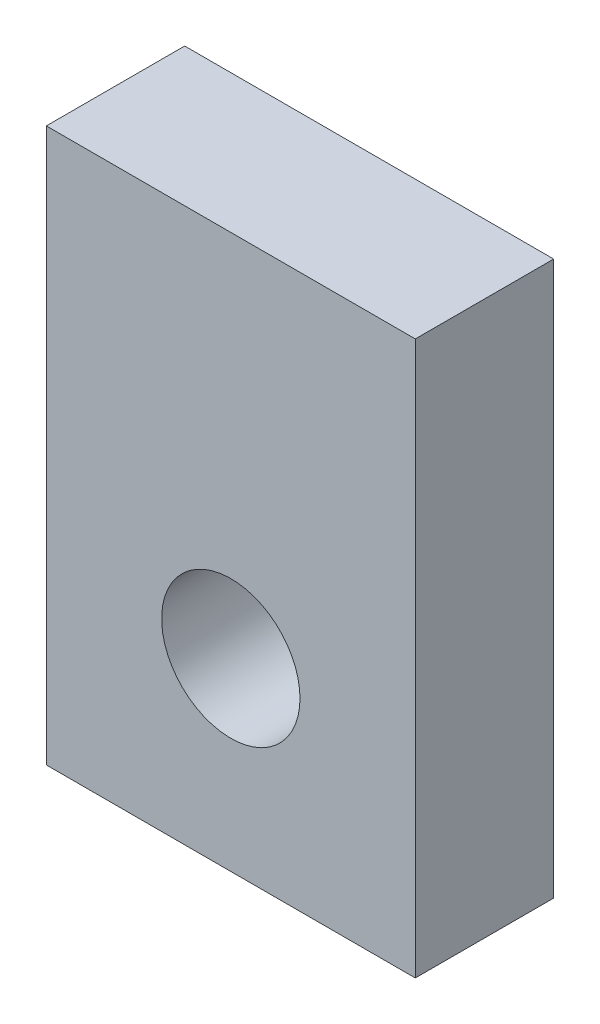
ISO-10303-21;
HEADER;
FILE_DESCRIPTION(('STEP AP214'),'2;1');
FILE_NAME('part.step','',(''),(''),'','','');
FILE_SCHEMA(('AUTOMOTIVE_DESIGN { 1 0 10303 214 1 1 1 1 }'));
ENDSEC;
DATA;
#1=APPLICATION_CONTEXT('core data for automotive mechanical design processes');
#2=APPLICATION_PROTOCOL_DEFINITION('international standard','automotive_design',2000,#1);
#3=PRODUCT_CONTEXT('',#1,'mechanical');
#4=PRODUCT('Part','Part','',(#3));
#5=PRODUCT_RELATED_PRODUCT_CATEGORY('part','',(#4));
#6=PRODUCT_DEFINITION_FORMATION('','',#4);
#7=PRODUCT_DEFINITION_CONTEXT('part definition',#1,'design');
#8=PRODUCT_DEFINITION('design','',#6,#7);
#9=PRODUCT_DEFINITION_SHAPE('','',#8);
#10=(LENGTH_UNIT() NAMED_UNIT(*) SI_UNIT(.MILLI.,.METRE.));
#11=(NAMED_UNIT(*) PLANE_ANGLE_UNIT() SI_UNIT($,.RADIAN.));
#12=(NAMED_UNIT(*) SI_UNIT($,.STERADIAN.) SOLID_ANGLE_UNIT());
#13=UNCERTAINTY_MEASURE_WITH_UNIT(LENGTH_MEASURE(1.E-05),#10,'distance_accuracy_value','');
#14=(GEOMETRIC_REPRESENTATION_CONTEXT(3) GLOBAL_UNCERTAINTY_ASSIGNED_CONTEXT((#13)) GLOBAL_UNIT_ASSIGNED_CONTEXT((#10,
#11,#12)) REPRESENTATION_CONTEXT('',''));
#15=CARTESIAN_POINT('',(0.,0.,0.));
#16=DIRECTION('',(0.,0.,1.));
#17=DIRECTION('',(1.,0.,0.));
#18=AXIS2_PLACEMENT_3D('',#15,#16,#17);
#19=CARTESIAN_POINT('',(0.,0.,3.));
#20=DIRECTION('',(1.,0.,0.));
#21=DIRECTION('',(0.,1.,0.));
#22=AXIS2_PLACEMENT_3D('',#19,#20,#21);
#23=PLANE('',#22);
#24=DIRECTION('',(0.,-1.,0.));
#25=VECTOR('',#24,1.);
#26=CARTESIAN_POINT('',(0.,0.,0.));
#27=LINE('',#26,#25);
#28=CARTESIAN_POINT('',(0.,12.,0.));
#29=VERTEX_POINT('',#28);
#30=CARTESIAN_POINT('',(0.,0.,0.));
#31=VERTEX_POINT('',#30);
#32=EDGE_CURVE('E98',#29,#31,#27,.T.);
#33=ORIENTED_EDGE('',*,*,#32,.T.);
#34=DIRECTION('',(0.,0.,-1.));
#35=VECTOR('',#34,1.);
#36=CARTESIAN_POINT('',(0.,0.,3.));
#37=LINE('',#36,#35);
#38=CARTESIAN_POINT('',(0.,0.,3.));
#39=VERTEX_POINT('',#38);
#40=EDGE_CURVE('E11',#39,#31,#37,.T.);
#41=ORIENTED_EDGE('',*,*,#40,.F.);
#42=DIRECTION('',(0.,-1.,0.));
#43=VECTOR('',#42,1.);
#44=CARTESIAN_POINT('',(0.,0.,3.));
#45=LINE('',#44,#43);
#46=CARTESIAN_POINT('',(0.,12.,3.));
#47=VERTEX_POINT('',#46);
#48=EDGE_CURVE('E86',#47,#39,#45,.T.);
#49=ORIENTED_EDGE('',*,*,#48,.F.);
#50=DIRECTION('',(0.,0.,-1.));
#51=VECTOR('',#50,1.);
#52=CARTESIAN_POINT('',(0.,12.,3.));
#53=LINE('',#52,#51);
#54=EDGE_CURVE('E94',#47,#29,#53,.T.);
#55=ORIENTED_EDGE('',*,*,#54,.T.);
#56=EDGE_LOOP('',(#33,#41,#49,#55));
#57=FACE_BOUND('',#56,.T.);
#58=ADVANCED_FACE('F35',(#57),#23,.F.);
#59=CARTESIAN_POINT('',(0.,0.,3.));
#60=DIRECTION('',(0.,1.,0.));
#61=DIRECTION('',(0.,0.,1.));
#62=AXIS2_PLACEMENT_3D('',#59,#60,#61);
#63=PLANE('',#62);
#64=DIRECTION('',(1.,0.,0.));
#65=VECTOR('',#64,1.);
#66=CARTESIAN_POINT('',(0.,0.,0.));
#67=LINE('',#66,#65);
#68=CARTESIAN_POINT('',(8.,0.,0.));
#69=VERTEX_POINT('',#68);
#70=EDGE_CURVE('E90',#31,#69,#67,.T.);
#71=ORIENTED_EDGE('',*,*,#70,.T.);
#72=DIRECTION('',(0.,0.,-1.));
#73=VECTOR('',#72,1.);
#74=CARTESIAN_POINT('',(8.,0.,3.));
#75=LINE('',#74,#73);
#76=CARTESIAN_POINT('',(8.,0.,3.));
#77=VERTEX_POINT('',#76);
#78=EDGE_CURVE('E43',#77,#69,#75,.T.);
#79=ORIENTED_EDGE('',*,*,#78,.F.);
#80=DIRECTION('',(1.,0.,0.));
#81=VECTOR('',#80,1.);
#82=CARTESIAN_POINT('',(0.,0.,3.));
#83=LINE('',#82,#81);
#84=EDGE_CURVE('E81',#39,#77,#83,.T.);
#85=ORIENTED_EDGE('',*,*,#84,.F.);
#86=ORIENTED_EDGE('',*,*,#40,.T.);
#87=EDGE_LOOP('',(#71,#79,#85,#86));
#88=FACE_BOUND('',#87,.T.);
#89=ADVANCED_FACE('F89',(#88),#63,.F.);
#90=CARTESIAN_POINT('',(8.,0.,3.));
#91=DIRECTION('',(-1.,0.,0.));
#92=DIRECTION('',(0.,-1.,0.));
#93=AXIS2_PLACEMENT_3D('',#90,#91,#92);
#94=PLANE('',#93);
#95=DIRECTION('',(0.,1.,0.));
#96=VECTOR('',#95,1.);
#97=CARTESIAN_POINT('',(8.,0.,0.));
#98=LINE('',#97,#96);
#99=CARTESIAN_POINT('',(8.,12.,0.));
#100=VERTEX_POINT('',#99);
#101=EDGE_CURVE('E68',#69,#100,#98,.T.);
#102=ORIENTED_EDGE('',*,*,#101,.T.);
#103=DIRECTION('',(0.,0.,-1.));
#104=VECTOR('',#103,1.);
#105=CARTESIAN_POINT('',(8.,12.,3.));
#106=LINE('',#105,#104);
#107=CARTESIAN_POINT('',(8.,12.,3.));
#108=VERTEX_POINT('',#107);
#109=EDGE_CURVE('E91',#108,#100,#106,.T.);
#110=ORIENTED_EDGE('',*,*,#109,.F.);
#111=DIRECTION('',(0.,1.,0.));
#112=VECTOR('',#111,1.);
#113=CARTESIAN_POINT('',(8.,0.,3.));
#114=LINE('',#113,#112);
#115=EDGE_CURVE('E84',#77,#108,#114,.T.);
#116=ORIENTED_EDGE('',*,*,#115,.F.);
#117=ORIENTED_EDGE('',*,*,#78,.T.);
#118=EDGE_LOOP('',(#102,#110,#116,#117));
#119=FACE_BOUND('',#118,.T.);
#120=ADVANCED_FACE('F92',(#119),#94,.F.);
#121=CARTESIAN_POINT('',(0.,12.,3.));
#122=DIRECTION('',(0.,-1.,0.));
#123=DIRECTION('',(0.,0.,-1.));
#124=AXIS2_PLACEMENT_3D('',#121,#122,#123);
#125=PLANE('',#124);
#126=DIRECTION('',(-1.,0.,0.));
#127=VECTOR('',#126,1.);
#128=CARTESIAN_POINT('',(0.,12.,0.));
#129=LINE('',#128,#127);
#130=EDGE_CURVE('E74',#100,#29,#129,.T.);
#131=ORIENTED_EDGE('',*,*,#130,.T.);
#132=ORIENTED_EDGE('',*,*,#54,.F.);
#133=DIRECTION('',(-1.,0.,0.));
#134=VECTOR('',#133,1.);
#135=CARTESIAN_POINT('',(0.,12.,3.));
#136=LINE('',#135,#134);
#137=EDGE_CURVE('E51',#108,#47,#136,.T.);
#138=ORIENTED_EDGE('',*,*,#137,.F.);
#139=ORIENTED_EDGE('',*,*,#109,.T.);
#140=EDGE_LOOP('',(#131,#132,#138,#139));
#141=FACE_BOUND('',#140,.T.);
#142=ADVANCED_FACE('F106',(#141),#125,.F.);
#143=CARTESIAN_POINT('',(0.,0.,3.));
#144=DIRECTION('',(0.,0.,-1.));
#145=DIRECTION('',(-1.,0.,0.));
#146=AXIS2_PLACEMENT_3D('',#143,#144,#145);
#147=PLANE('',#146);
#148=CARTESIAN_POINT('',(4.,4.,3.));
#149=DIRECTION('',(0.,0.,1.));
#150=DIRECTION('',(1.,0.,0.));
#151=AXIS2_PLACEMENT_3D('',#148,#149,#150);
#152=CIRCLE('',#151,1.5);
#153=CARTESIAN_POINT('',(5.5,4.,3.));
#154=VERTEX_POINT('',#153);
#155=EDGE_CURVE('E112',#154,#154,#152,.T.);
#156=ORIENTED_EDGE('',*,*,#155,.F.);
#157=EDGE_LOOP('',(#156));
#158=FACE_BOUND('',#157,.T.);
#159=ORIENTED_EDGE('',*,*,#48,.T.);
#160=ORIENTED_EDGE('',*,*,#84,.T.);
#161=ORIENTED_EDGE('',*,*,#115,.T.);
#162=ORIENTED_EDGE('',*,*,#137,.T.);
#163=EDGE_LOOP('',(#159,#160,#161,#162));
#164=FACE_BOUND('',#163,.T.);
#165=ADVANCED_FACE('F82',(#158,#164),#147,.F.);
#166=CARTESIAN_POINT('',(0.,0.,0.));
#167=DIRECTION('',(0.,0.,-1.));
#168=DIRECTION('',(-1.,0.,0.));
#169=AXIS2_PLACEMENT_3D('',#166,#167,#168);
#170=PLANE('',#169);
#171=CARTESIAN_POINT('',(4.,4.,0.));
#172=DIRECTION('',(0.,0.,1.));
#173=DIRECTION('',(1.,0.,0.));
#174=AXIS2_PLACEMENT_3D('',#171,#172,#173);
#175=CIRCLE('',#174,1.5);
#176=CARTESIAN_POINT('',(5.5,4.,0.));
#177=VERTEX_POINT('',#176);
#178=EDGE_CURVE('E101',#177,#177,#175,.T.);
#179=ORIENTED_EDGE('',*,*,#178,.T.);
#180=EDGE_LOOP('',(#179));
#181=FACE_BOUND('',#180,.T.);
#182=ORIENTED_EDGE('',*,*,#32,.F.);
#183=ORIENTED_EDGE('',*,*,#130,.F.);
#184=ORIENTED_EDGE('',*,*,#101,.F.);
#185=ORIENTED_EDGE('',*,*,#70,.F.);
#186=EDGE_LOOP('',(#182,#183,#184,#185));
#187=FACE_BOUND('',#186,.T.);
#188=ADVANCED_FACE('F109',(#181,#187),#170,.T.);
#189=CARTESIAN_POINT('',(4.,4.,0.));
#190=DIRECTION('',(0.,0.,1.));
#191=DIRECTION('',(1.,0.,0.));
#192=AXIS2_PLACEMENT_3D('',#189,#190,#191);
#193=CYLINDRICAL_SURFACE('',#192,1.5);
#194=ORIENTED_EDGE('',*,*,#178,.F.);
#195=EDGE_LOOP('',(#194));
#196=FACE_BOUND('',#195,.T.);
#197=ORIENTED_EDGE('',*,*,#155,.T.);
#198=EDGE_LOOP('',(#197));
#199=FACE_BOUND('',#198,.T.);
#200=ADVANCED_FACE('F119',(#196,#199),#193,.F.);
#201=CLOSED_SHELL('',(#58,#89,#120,#142,#165,#188,#200));
#202=MANIFOLD_SOLID_BREP('B2',#201);
#203=ADVANCED_BREP_SHAPE_REPRESENTATION('',(#18,#202),#14);
#204=SHAPE_DEFINITION_REPRESENTATION(#9,#203);
ENDSEC;
END-ISO-10303-21;
